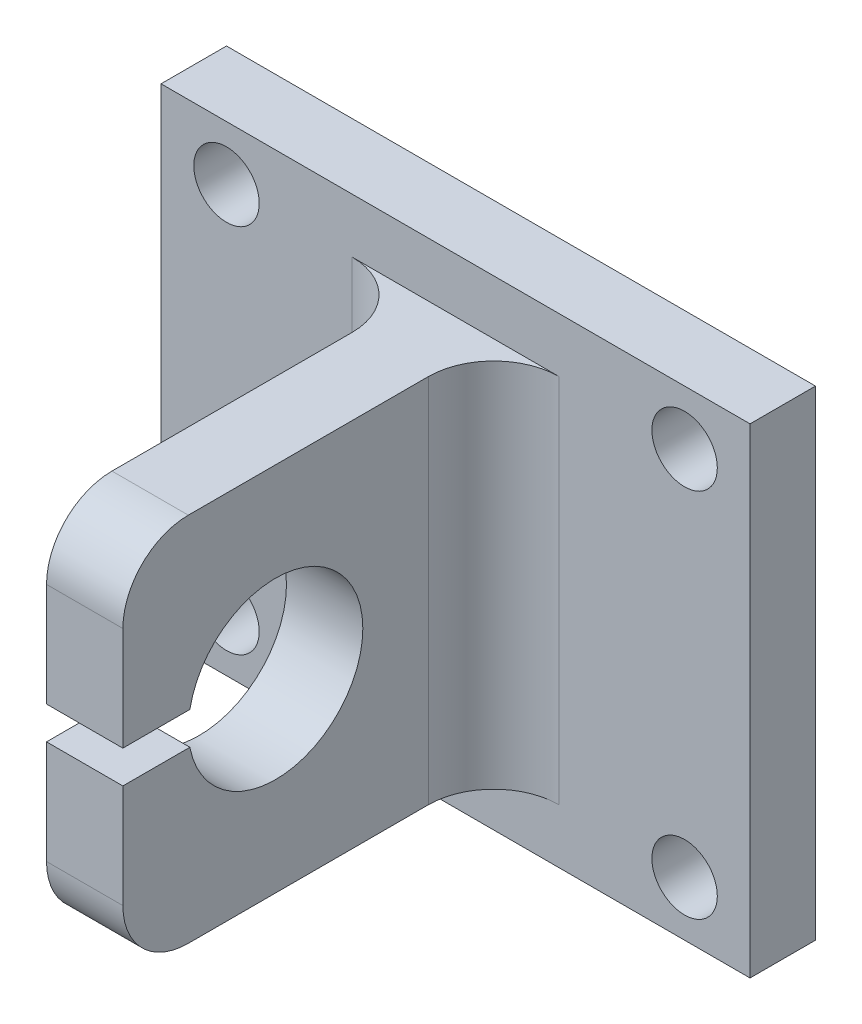
ISO-10303-21;
HEADER;
FILE_DESCRIPTION(('STEP AP214'),'2;1');
FILE_NAME('part.step','',(''),(''),'','','');
FILE_SCHEMA(('AUTOMOTIVE_DESIGN { 1 0 10303 214 1 1 1 1 }'));
ENDSEC;
DATA;
#1=APPLICATION_CONTEXT('core data for automotive mechanical design processes');
#2=APPLICATION_PROTOCOL_DEFINITION('international standard','automotive_design',2000,#1);
#3=PRODUCT_CONTEXT('',#1,'mechanical');
#4=PRODUCT('Part','Part','',(#3));
#5=PRODUCT_RELATED_PRODUCT_CATEGORY('part','',(#4));
#6=PRODUCT_DEFINITION_FORMATION('','',#4);
#7=PRODUCT_DEFINITION_CONTEXT('part definition',#1,'design');
#8=PRODUCT_DEFINITION('design','',#6,#7);
#9=PRODUCT_DEFINITION_SHAPE('','',#8);
#10=(LENGTH_UNIT() NAMED_UNIT(*) SI_UNIT(.MILLI.,.METRE.));
#11=(NAMED_UNIT(*) PLANE_ANGLE_UNIT() SI_UNIT($,.RADIAN.));
#12=(NAMED_UNIT(*) SI_UNIT($,.STERADIAN.) SOLID_ANGLE_UNIT());
#13=UNCERTAINTY_MEASURE_WITH_UNIT(LENGTH_MEASURE(1.E-05),#10,'distance_accuracy_value','');
#14=(GEOMETRIC_REPRESENTATION_CONTEXT(3) GLOBAL_UNCERTAINTY_ASSIGNED_CONTEXT((#13)) GLOBAL_UNIT_ASSIGNED_CONTEXT((#10,
#11,#12)) REPRESENTATION_CONTEXT('',''));
#15=CARTESIAN_POINT('',(0.,0.,0.));
#16=DIRECTION('',(0.,0.,1.));
#17=DIRECTION('',(1.,0.,0.));
#18=AXIS2_PLACEMENT_3D('',#15,#16,#17);
#19=CARTESIAN_POINT('',(0.,0.,20.));
#20=DIRECTION('',(0.,0.,1.));
#21=DIRECTION('',(1.,0.,0.));
#22=AXIS2_PLACEMENT_3D('',#19,#20,#21);
#23=PLANE('',#22);
#24=DIRECTION('',(0.,1.,0.));
#25=VECTOR('',#24,1.);
#26=CARTESIAN_POINT('',(1.75,8.5,20.));
#27=LINE('',#26,#25);
#28=CARTESIAN_POINT('',(1.75,0.75,20.));
#29=VERTEX_POINT('',#28);
#30=CARTESIAN_POINT('',(1.75,5.5,20.));
#31=VERTEX_POINT('',#30);
#32=EDGE_CURVE('E201',#29,#31,#27,.T.);
#33=ORIENTED_EDGE('',*,*,#32,.T.);
#34=DIRECTION('',(-1.,0.,0.));
#35=VECTOR('',#34,1.);
#36=CARTESIAN_POINT('',(-1.75,5.5,20.));
#37=LINE('',#36,#35);
#38=CARTESIAN_POINT('',(-1.75,5.5,20.));
#39=VERTEX_POINT('',#38);
#40=EDGE_CURVE('E326',#31,#39,#37,.T.);
#41=ORIENTED_EDGE('',*,*,#40,.T.);
#42=DIRECTION('',(0.,-1.,0.));
#43=VECTOR('',#42,1.);
#44=CARTESIAN_POINT('',(-1.75,8.5,20.));
#45=LINE('',#44,#43);
#46=CARTESIAN_POINT('',(-1.75,0.75,20.));
#47=VERTEX_POINT('',#46);
#48=EDGE_CURVE('E198',#39,#47,#45,.T.);
#49=ORIENTED_EDGE('',*,*,#48,.T.);
#50=DIRECTION('',(-1.,0.,0.));
#51=VECTOR('',#50,1.);
#52=CARTESIAN_POINT('',(0.,0.75,20.));
#53=LINE('',#52,#51);
#54=EDGE_CURVE('E193',#29,#47,#53,.T.);
#55=ORIENTED_EDGE('',*,*,#54,.F.);
#56=EDGE_LOOP('',(#33,#41,#49,#55));
#57=FACE_BOUND('',#56,.T.);
#58=ADVANCED_FACE('F43',(#57),#23,.T.);
#59=CARTESIAN_POINT('',(0.,0.,3.));
#60=DIRECTION('',(0.,0.,-1.));
#61=DIRECTION('',(-1.,0.,0.));
#62=AXIS2_PLACEMENT_3D('',#59,#60,#61);
#63=PLANE('',#62);
#64=CARTESIAN_POINT('',(-10.5,8.5,3.));
#65=DIRECTION('',(0.,0.,1.));
#66=DIRECTION('',(1.,0.,0.));
#67=AXIS2_PLACEMENT_3D('',#64,#65,#66);
#68=CIRCLE('',#67,1.5);
#69=CARTESIAN_POINT('',(-9.,8.5,3.));
#70=VERTEX_POINT('',#69);
#71=EDGE_CURVE('E220',#70,#70,#68,.T.);
#72=ORIENTED_EDGE('',*,*,#71,.F.);
#73=EDGE_LOOP('',(#72));
#74=FACE_BOUND('',#73,.T.);
#75=CARTESIAN_POINT('',(-10.5,-8.5,3.));
#76=DIRECTION('',(0.,0.,1.));
#77=DIRECTION('',(1.,0.,0.));
#78=AXIS2_PLACEMENT_3D('',#75,#76,#77);
#79=CIRCLE('',#78,1.5);
#80=CARTESIAN_POINT('',(-9.,-8.5,3.));
#81=VERTEX_POINT('',#80);
#82=EDGE_CURVE('E228',#81,#81,#79,.T.);
#83=ORIENTED_EDGE('',*,*,#82,.F.);
#84=EDGE_LOOP('',(#83));
#85=FACE_BOUND('',#84,.T.);
#86=CARTESIAN_POINT('',(10.5,-8.5,3.));
#87=DIRECTION('',(0.,0.,1.));
#88=DIRECTION('',(1.,0.,0.));
#89=AXIS2_PLACEMENT_3D('',#86,#87,#88);
#90=CIRCLE('',#89,1.5);
#91=CARTESIAN_POINT('',(12.,-8.5,3.));
#92=VERTEX_POINT('',#91);
#93=EDGE_CURVE('E236',#92,#92,#90,.T.);
#94=ORIENTED_EDGE('',*,*,#93,.F.);
#95=EDGE_LOOP('',(#94));
#96=FACE_BOUND('',#95,.T.);
#97=CARTESIAN_POINT('',(10.5,8.5,3.));
#98=DIRECTION('',(0.,0.,1.));
#99=DIRECTION('',(1.,0.,0.));
#100=AXIS2_PLACEMENT_3D('',#97,#98,#99);
#101=CIRCLE('',#100,1.5);
#102=CARTESIAN_POINT('',(12.,8.5,3.));
#103=VERTEX_POINT('',#102);
#104=EDGE_CURVE('E244',#103,#103,#101,.T.);
#105=ORIENTED_EDGE('',*,*,#104,.F.);
#106=EDGE_LOOP('',(#105));
#107=FACE_BOUND('',#106,.T.);
#108=DIRECTION('',(0.,1.,0.));
#109=VECTOR('',#108,1.);
#110=CARTESIAN_POINT('',(13.5,-11.,3.));
#111=LINE('',#110,#109);
#112=CARTESIAN_POINT('',(13.5,-11.,3.));
#113=VERTEX_POINT('',#112);
#114=CARTESIAN_POINT('',(13.5,11.,3.));
#115=VERTEX_POINT('',#114);
#116=EDGE_CURVE('E252',#113,#115,#111,.T.);
#117=ORIENTED_EDGE('',*,*,#116,.T.);
#118=DIRECTION('',(-1.,0.,0.));
#119=VECTOR('',#118,1.);
#120=CARTESIAN_POINT('',(-13.5,11.,3.));
#121=LINE('',#120,#119);
#122=CARTESIAN_POINT('',(-13.5,11.,3.));
#123=VERTEX_POINT('',#122);
#124=EDGE_CURVE('E256',#115,#123,#121,.T.);
#125=ORIENTED_EDGE('',*,*,#124,.T.);
#126=DIRECTION('',(0.,-1.,0.));
#127=VECTOR('',#126,1.);
#128=CARTESIAN_POINT('',(-13.5,-11.,3.));
#129=LINE('',#128,#127);
#130=CARTESIAN_POINT('',(-13.5,-11.,3.));
#131=VERTEX_POINT('',#130);
#132=EDGE_CURVE('E260',#123,#131,#129,.T.);
#133=ORIENTED_EDGE('',*,*,#132,.T.);
#134=DIRECTION('',(1.,0.,0.));
#135=VECTOR('',#134,1.);
#136=CARTESIAN_POINT('',(-13.5,-11.,3.));
#137=LINE('',#136,#135);
#138=EDGE_CURVE('E263',#131,#113,#137,.T.);
#139=ORIENTED_EDGE('',*,*,#138,.T.);
#140=EDGE_LOOP('',(#117,#125,#133,#139));
#141=FACE_BOUND('',#140,.T.);
#142=DIRECTION('',(1.,0.,0.));
#143=VECTOR('',#142,1.);
#144=CARTESIAN_POINT('',(-1.75,-8.5,3.));
#145=LINE('',#144,#143);
#146=CARTESIAN_POINT('',(-4.75,-8.5,3.));
#147=VERTEX_POINT('',#146);
#148=CARTESIAN_POINT('',(4.75,-8.5,3.));
#149=VERTEX_POINT('',#148);
#150=EDGE_CURVE('E186',#147,#149,#145,.T.);
#151=ORIENTED_EDGE('',*,*,#150,.F.);
#152=DIRECTION('',(0.,-1.,0.));
#153=VECTOR('',#152,1.);
#154=CARTESIAN_POINT('',(-4.75,8.5,3.));
#155=LINE('',#154,#153);
#156=CARTESIAN_POINT('',(-4.75,8.5,3.));
#157=VERTEX_POINT('',#156);
#158=EDGE_CURVE('E302',#147,#157,#155,.F.);
#159=ORIENTED_EDGE('',*,*,#158,.T.);
#160=DIRECTION('',(-1.,0.,0.));
#161=VECTOR('',#160,1.);
#162=CARTESIAN_POINT('',(-1.75,8.5,3.));
#163=LINE('',#162,#161);
#164=CARTESIAN_POINT('',(4.75,8.5,3.));
#165=VERTEX_POINT('',#164);
#166=EDGE_CURVE('E191',#165,#157,#163,.T.);
#167=ORIENTED_EDGE('',*,*,#166,.F.);
#168=DIRECTION('',(0.,1.,0.));
#169=VECTOR('',#168,1.);
#170=CARTESIAN_POINT('',(4.75,-8.5,3.));
#171=LINE('',#170,#169);
#172=EDGE_CURVE('E298',#165,#149,#171,.F.);
#173=ORIENTED_EDGE('',*,*,#172,.T.);
#174=EDGE_LOOP('',(#151,#159,#167,#173));
#175=FACE_BOUND('',#174,.T.);
#176=ADVANCED_FACE('F393',(#74,#85,#96,#107,#141,#175),#63,.F.);
#177=CARTESIAN_POINT('',(0.,0.,0.));
#178=DIRECTION('',(0.,0.,-1.));
#179=DIRECTION('',(-1.,0.,0.));
#180=AXIS2_PLACEMENT_3D('',#177,#178,#179);
#181=PLANE('',#180);
#182=CARTESIAN_POINT('',(-10.5,-8.5,0.));
#183=DIRECTION('',(0.,0.,1.));
#184=DIRECTION('',(1.,0.,0.));
#185=AXIS2_PLACEMENT_3D('',#182,#183,#184);
#186=CIRCLE('',#185,1.5);
#187=CARTESIAN_POINT('',(-9.,-8.5,0.));
#188=VERTEX_POINT('',#187);
#189=EDGE_CURVE('E224',#188,#188,#186,.T.);
#190=ORIENTED_EDGE('',*,*,#189,.T.);
#191=EDGE_LOOP('',(#190));
#192=FACE_BOUND('',#191,.T.);
#193=CARTESIAN_POINT('',(10.5,8.5,0.));
#194=DIRECTION('',(0.,0.,1.));
#195=DIRECTION('',(1.,0.,0.));
#196=AXIS2_PLACEMENT_3D('',#193,#194,#195);
#197=CIRCLE('',#196,1.5);
#198=CARTESIAN_POINT('',(12.,8.5,0.));
#199=VERTEX_POINT('',#198);
#200=EDGE_CURVE('E240',#199,#199,#197,.T.);
#201=ORIENTED_EDGE('',*,*,#200,.T.);
#202=EDGE_LOOP('',(#201));
#203=FACE_BOUND('',#202,.T.);
#204=DIRECTION('',(0.,1.,0.));
#205=VECTOR('',#204,1.);
#206=CARTESIAN_POINT('',(13.5,-11.,0.));
#207=LINE('',#206,#205);
#208=CARTESIAN_POINT('',(13.5,-11.,0.));
#209=VERTEX_POINT('',#208);
#210=CARTESIAN_POINT('',(13.5,11.,0.));
#211=VERTEX_POINT('',#210);
#212=EDGE_CURVE('E248',#209,#211,#207,.T.);
#213=ORIENTED_EDGE('',*,*,#212,.F.);
#214=DIRECTION('',(1.,0.,0.));
#215=VECTOR('',#214,1.);
#216=CARTESIAN_POINT('',(-13.5,-11.,0.));
#217=LINE('',#216,#215);
#218=CARTESIAN_POINT('',(-13.5,-11.,0.));
#219=VERTEX_POINT('',#218);
#220=EDGE_CURVE('E257',#219,#209,#217,.T.);
#221=ORIENTED_EDGE('',*,*,#220,.F.);
#222=DIRECTION('',(0.,-1.,0.));
#223=VECTOR('',#222,1.);
#224=CARTESIAN_POINT('',(-13.5,-11.,0.));
#225=LINE('',#224,#223);
#226=CARTESIAN_POINT('',(-13.5,11.,0.));
#227=VERTEX_POINT('',#226);
#228=EDGE_CURVE('E273',#227,#219,#225,.T.);
#229=ORIENTED_EDGE('',*,*,#228,.F.);
#230=DIRECTION('',(-1.,0.,0.));
#231=VECTOR('',#230,1.);
#232=CARTESIAN_POINT('',(-13.5,11.,0.));
#233=LINE('',#232,#231);
#234=EDGE_CURVE('E270',#211,#227,#233,.T.);
#235=ORIENTED_EDGE('',*,*,#234,.F.);
#236=EDGE_LOOP('',(#213,#221,#229,#235));
#237=FACE_BOUND('',#236,.T.);
#238=CARTESIAN_POINT('',(10.5,-8.5,0.));
#239=DIRECTION('',(0.,0.,1.));
#240=DIRECTION('',(1.,0.,0.));
#241=AXIS2_PLACEMENT_3D('',#238,#239,#240);
#242=CIRCLE('',#241,1.5);
#243=CARTESIAN_POINT('',(12.,-8.5,0.));
#244=VERTEX_POINT('',#243);
#245=EDGE_CURVE('E232',#244,#244,#242,.T.);
#246=ORIENTED_EDGE('',*,*,#245,.T.);
#247=EDGE_LOOP('',(#246));
#248=FACE_BOUND('',#247,.T.);
#249=CARTESIAN_POINT('',(-10.5,8.5,0.));
#250=DIRECTION('',(0.,0.,1.));
#251=DIRECTION('',(1.,0.,0.));
#252=AXIS2_PLACEMENT_3D('',#249,#250,#251);
#253=CIRCLE('',#252,1.5);
#254=CARTESIAN_POINT('',(-9.,8.5,0.));
#255=VERTEX_POINT('',#254);
#256=EDGE_CURVE('E219',#255,#255,#253,.T.);
#257=ORIENTED_EDGE('',*,*,#256,.T.);
#258=EDGE_LOOP('',(#257));
#259=FACE_BOUND('',#258,.T.);
#260=ADVANCED_FACE('F395',(#192,#203,#237,#248,#259),#181,.T.);
#261=CARTESIAN_POINT('',(13.5,-11.,3.));
#262=DIRECTION('',(-1.,0.,0.));
#263=DIRECTION('',(0.,0.,1.));
#264=AXIS2_PLACEMENT_3D('',#261,#262,#263);
#265=PLANE('',#264);
#266=ORIENTED_EDGE('',*,*,#212,.T.);
#267=DIRECTION('',(0.,0.,-1.));
#268=VECTOR('',#267,1.);
#269=CARTESIAN_POINT('',(13.5,11.,3.));
#270=LINE('',#269,#268);
#271=EDGE_CURVE('E169',#115,#211,#270,.T.);
#272=ORIENTED_EDGE('',*,*,#271,.F.);
#273=ORIENTED_EDGE('',*,*,#116,.F.);
#274=DIRECTION('',(0.,0.,-1.));
#275=VECTOR('',#274,1.);
#276=CARTESIAN_POINT('',(13.5,-11.,3.));
#277=LINE('',#276,#275);
#278=EDGE_CURVE('E266',#113,#209,#277,.T.);
#279=ORIENTED_EDGE('',*,*,#278,.T.);
#280=EDGE_LOOP('',(#266,#272,#273,#279));
#281=FACE_BOUND('',#280,.T.);
#282=ADVANCED_FACE('F402',(#281),#265,.F.);
#283=CARTESIAN_POINT('',(-13.5,11.,3.));
#284=DIRECTION('',(0.,-1.,0.));
#285=DIRECTION('',(0.,0.,-1.));
#286=AXIS2_PLACEMENT_3D('',#283,#284,#285);
#287=PLANE('',#286);
#288=ORIENTED_EDGE('',*,*,#234,.T.);
#289=DIRECTION('',(0.,0.,-1.));
#290=VECTOR('',#289,1.);
#291=CARTESIAN_POINT('',(-13.5,11.,3.));
#292=LINE('',#291,#290);
#293=EDGE_CURVE('E285',#123,#227,#292,.T.);
#294=ORIENTED_EDGE('',*,*,#293,.F.);
#295=ORIENTED_EDGE('',*,*,#124,.F.);
#296=ORIENTED_EDGE('',*,*,#271,.T.);
#297=EDGE_LOOP('',(#288,#294,#295,#296));
#298=FACE_BOUND('',#297,.T.);
#299=ADVANCED_FACE('F419',(#298),#287,.F.);
#300=CARTESIAN_POINT('',(-13.5,-11.,3.));
#301=DIRECTION('',(1.,0.,0.));
#302=DIRECTION('',(0.,0.,-1.));
#303=AXIS2_PLACEMENT_3D('',#300,#301,#302);
#304=PLANE('',#303);
#305=ORIENTED_EDGE('',*,*,#228,.T.);
#306=DIRECTION('',(0.,0.,-1.));
#307=VECTOR('',#306,1.);
#308=CARTESIAN_POINT('',(-13.5,-11.,3.));
#309=LINE('',#308,#307);
#310=EDGE_CURVE('E281',#131,#219,#309,.T.);
#311=ORIENTED_EDGE('',*,*,#310,.F.);
#312=ORIENTED_EDGE('',*,*,#132,.F.);
#313=ORIENTED_EDGE('',*,*,#293,.T.);
#314=EDGE_LOOP('',(#305,#311,#312,#313));
#315=FACE_BOUND('',#314,.T.);
#316=ADVANCED_FACE('F415',(#315),#304,.F.);
#317=CARTESIAN_POINT('',(-13.5,-11.,3.));
#318=DIRECTION('',(0.,1.,0.));
#319=DIRECTION('',(0.,0.,1.));
#320=AXIS2_PLACEMENT_3D('',#317,#318,#319);
#321=PLANE('',#320);
#322=ORIENTED_EDGE('',*,*,#220,.T.);
#323=ORIENTED_EDGE('',*,*,#278,.F.);
#324=ORIENTED_EDGE('',*,*,#138,.F.);
#325=ORIENTED_EDGE('',*,*,#310,.T.);
#326=EDGE_LOOP('',(#322,#323,#324,#325));
#327=FACE_BOUND('',#326,.T.);
#328=ADVANCED_FACE('F412',(#327),#321,.F.);
#329=CARTESIAN_POINT('',(10.5,8.5,3.));
#330=DIRECTION('',(0.,0.,-1.));
#331=DIRECTION('',(-1.,0.,0.));
#332=AXIS2_PLACEMENT_3D('',#329,#330,#331);
#333=CYLINDRICAL_SURFACE('',#332,1.5);
#334=ORIENTED_EDGE('',*,*,#104,.T.);
#335=EDGE_LOOP('',(#334));
#336=FACE_BOUND('',#335,.T.);
#337=ORIENTED_EDGE('',*,*,#200,.F.);
#338=EDGE_LOOP('',(#337));
#339=FACE_BOUND('',#338,.T.);
#340=ADVANCED_FACE('F409',(#336,#339),#333,.F.);
#341=CARTESIAN_POINT('',(10.5,-8.5,3.));
#342=DIRECTION('',(0.,0.,-1.));
#343=DIRECTION('',(-1.,0.,0.));
#344=AXIS2_PLACEMENT_3D('',#341,#342,#343);
#345=CYLINDRICAL_SURFACE('',#344,1.5);
#346=ORIENTED_EDGE('',*,*,#93,.T.);
#347=EDGE_LOOP('',(#346));
#348=FACE_BOUND('',#347,.T.);
#349=ORIENTED_EDGE('',*,*,#245,.F.);
#350=EDGE_LOOP('',(#349));
#351=FACE_BOUND('',#350,.T.);
#352=ADVANCED_FACE('F558',(#348,#351),#345,.F.);
#353=CARTESIAN_POINT('',(-10.5,-8.5,3.));
#354=DIRECTION('',(0.,0.,-1.));
#355=DIRECTION('',(-1.,0.,0.));
#356=AXIS2_PLACEMENT_3D('',#353,#354,#355);
#357=CYLINDRICAL_SURFACE('',#356,1.5);
#358=ORIENTED_EDGE('',*,*,#82,.T.);
#359=EDGE_LOOP('',(#358));
#360=FACE_BOUND('',#359,.T.);
#361=ORIENTED_EDGE('',*,*,#189,.F.);
#362=EDGE_LOOP('',(#361));
#363=FACE_BOUND('',#362,.T.);
#364=ADVANCED_FACE('F548',(#360,#363),#357,.F.);
#365=CARTESIAN_POINT('',(-10.5,8.5,3.));
#366=DIRECTION('',(0.,0.,-1.));
#367=DIRECTION('',(-1.,0.,0.));
#368=AXIS2_PLACEMENT_3D('',#365,#366,#367);
#369=CYLINDRICAL_SURFACE('',#368,1.5);
#370=ORIENTED_EDGE('',*,*,#71,.T.);
#371=EDGE_LOOP('',(#370));
#372=FACE_BOUND('',#371,.T.);
#373=ORIENTED_EDGE('',*,*,#256,.F.);
#374=EDGE_LOOP('',(#373));
#375=FACE_BOUND('',#374,.T.);
#376=ADVANCED_FACE('F489',(#372,#375),#369,.F.);
#377=CARTESIAN_POINT('',(-1.75,8.5,20.));
#378=DIRECTION('',(1.,0.,0.));
#379=DIRECTION('',(0.,1.,0.));
#380=AXIS2_PLACEMENT_3D('',#377,#378,#379);
#381=PLANE('',#380);
#382=ORIENTED_EDGE('',*,*,#48,.F.);
#383=CARTESIAN_POINT('',(-1.75,5.5,17.));
#384=DIRECTION('',(1.,0.,0.));
#385=DIRECTION('',(0.,1.,0.));
#386=AXIS2_PLACEMENT_3D('',#383,#384,#385);
#387=CIRCLE('',#386,3.);
#388=CARTESIAN_POINT('',(-1.75,8.5,17.));
#389=VERTEX_POINT('',#388);
#390=EDGE_CURVE('E333',#39,#389,#387,.F.);
#391=ORIENTED_EDGE('',*,*,#390,.T.);
#392=DIRECTION('',(0.,0.,-1.));
#393=VECTOR('',#392,1.);
#394=CARTESIAN_POINT('',(-1.75,8.5,20.));
#395=LINE('',#394,#393);
#396=CARTESIAN_POINT('',(-1.75,8.5,6.));
#397=VERTEX_POINT('',#396);
#398=EDGE_CURVE('E204',#389,#397,#395,.T.);
#399=ORIENTED_EDGE('',*,*,#398,.T.);
#400=DIRECTION('',(0.,-1.,0.));
#401=VECTOR('',#400,1.);
#402=CARTESIAN_POINT('',(-1.75,-8.5,6.));
#403=LINE('',#402,#401);
#404=CARTESIAN_POINT('',(-1.75,-8.5,6.));
#405=VERTEX_POINT('',#404);
#406=EDGE_CURVE('E294',#397,#405,#403,.T.);
#407=ORIENTED_EDGE('',*,*,#406,.T.);
#408=DIRECTION('',(0.,0.,-1.));
#409=VECTOR('',#408,1.);
#410=CARTESIAN_POINT('',(-1.75,-8.5,20.));
#411=LINE('',#410,#409);
#412=CARTESIAN_POINT('',(-1.75,-8.5,17.));
#413=VERTEX_POINT('',#412);
#414=EDGE_CURVE('E216',#413,#405,#411,.T.);
#415=ORIENTED_EDGE('',*,*,#414,.F.);
#416=CARTESIAN_POINT('',(-1.75,-5.5,17.));
#417=DIRECTION('',(1.,0.,0.));
#418=DIRECTION('',(0.,1.,0.));
#419=AXIS2_PLACEMENT_3D('',#416,#417,#418);
#420=CIRCLE('',#419,3.);
#421=CARTESIAN_POINT('',(-1.75,-5.5,20.));
#422=VERTEX_POINT('',#421);
#423=EDGE_CURVE('E330',#413,#422,#420,.F.);
#424=ORIENTED_EDGE('',*,*,#423,.T.);
#425=CARTESIAN_POINT('',(-1.75,-0.749999999999999,20.));
#426=VERTEX_POINT('',#425);
#427=EDGE_CURVE('E179',#426,#422,#45,.T.);
#428=ORIENTED_EDGE('',*,*,#427,.F.);
#429=DIRECTION('',(0.,0.,-1.));
#430=VECTOR('',#429,1.);
#431=CARTESIAN_POINT('',(-1.75,-0.749999999999999,20.));
#432=LINE('',#431,#430);
#433=CARTESIAN_POINT('',(-1.75,-0.75,16.9290584113754));
#434=VERTEX_POINT('',#433);
#435=EDGE_CURVE('E159',#426,#434,#432,.T.);
#436=ORIENTED_EDGE('',*,*,#435,.T.);
#437=CARTESIAN_POINT('',(-1.75,0.,13.));
#438=DIRECTION('',(1.,0.,0.));
#439=DIRECTION('',(0.,1.,0.));
#440=AXIS2_PLACEMENT_3D('',#437,#438,#439);
#441=CIRCLE('',#440,4.);
#442=CARTESIAN_POINT('',(-1.75,0.75,16.9290584113754));
#443=VERTEX_POINT('',#442);
#444=EDGE_CURVE('E177',#434,#443,#441,.T.);
#445=ORIENTED_EDGE('',*,*,#444,.T.);
#446=DIRECTION('',(0.,0.,1.));
#447=VECTOR('',#446,1.);
#448=CARTESIAN_POINT('',(-1.75,0.75,20.));
#449=LINE('',#448,#447);
#450=EDGE_CURVE('E357',#443,#47,#449,.T.);
#451=ORIENTED_EDGE('',*,*,#450,.T.);
#452=EDGE_LOOP('',(#382,#391,#399,#407,#415,#424,#428,#436,#445,#451));
#453=FACE_BOUND('',#452,.T.);
#454=ADVANCED_FACE('F175',(#453),#381,.F.);
#455=CARTESIAN_POINT('',(-1.75,-8.5,20.));
#456=DIRECTION('',(0.,1.,0.));
#457=DIRECTION('',(0.,0.,1.));
#458=AXIS2_PLACEMENT_3D('',#455,#456,#457);
#459=PLANE('',#458);
#460=DIRECTION('',(0.,0.,-1.));
#461=VECTOR('',#460,1.);
#462=CARTESIAN_POINT('',(1.75,-8.5,20.));
#463=LINE('',#462,#461);
#464=CARTESIAN_POINT('',(1.75,-8.5,17.));
#465=VERTEX_POINT('',#464);
#466=CARTESIAN_POINT('',(1.75,-8.5,6.));
#467=VERTEX_POINT('',#466);
#468=EDGE_CURVE('E213',#465,#467,#463,.T.);
#469=ORIENTED_EDGE('',*,*,#468,.F.);
#470=DIRECTION('',(1.,0.,0.));
#471=VECTOR('',#470,1.);
#472=CARTESIAN_POINT('',(-1.75,-8.5,17.));
#473=LINE('',#472,#471);
#474=EDGE_CURVE('E11',#465,#413,#473,.F.);
#475=ORIENTED_EDGE('',*,*,#474,.T.);
#476=ORIENTED_EDGE('',*,*,#414,.T.);
#477=CARTESIAN_POINT('',(-4.75,-8.5,6.));
#478=DIRECTION('',(0.,1.,0.));
#479=DIRECTION('',(0.,0.,1.));
#480=AXIS2_PLACEMENT_3D('',#477,#478,#479);
#481=CIRCLE('',#480,3.);
#482=EDGE_CURVE('E310',#405,#147,#481,.T.);
#483=ORIENTED_EDGE('',*,*,#482,.T.);
#484=ORIENTED_EDGE('',*,*,#150,.T.);
#485=CARTESIAN_POINT('',(4.75,-8.5,6.));
#486=DIRECTION('',(0.,1.,0.));
#487=DIRECTION('',(0.,0.,1.));
#488=AXIS2_PLACEMENT_3D('',#485,#486,#487);
#489=CIRCLE('',#488,3.);
#490=EDGE_CURVE('E322',#149,#467,#489,.T.);
#491=ORIENTED_EDGE('',*,*,#490,.T.);
#492=EDGE_LOOP('',(#469,#475,#476,#483,#484,#491));
#493=FACE_BOUND('',#492,.T.);
#494=ADVANCED_FACE('F385',(#493),#459,.F.);
#495=CARTESIAN_POINT('',(1.75,8.5,20.));
#496=DIRECTION('',(-1.,0.,0.));
#497=DIRECTION('',(0.,-1.,0.));
#498=AXIS2_PLACEMENT_3D('',#495,#496,#497);
#499=PLANE('',#498);
#500=DIRECTION('',(0.,0.,-1.));
#501=VECTOR('',#500,1.);
#502=CARTESIAN_POINT('',(1.75,8.5,20.));
#503=LINE('',#502,#501);
#504=CARTESIAN_POINT('',(1.75,8.5,17.));
#505=VERTEX_POINT('',#504);
#506=CARTESIAN_POINT('',(1.75,8.5,6.));
#507=VERTEX_POINT('',#506);
#508=EDGE_CURVE('E210',#505,#507,#503,.T.);
#509=ORIENTED_EDGE('',*,*,#508,.F.);
#510=CARTESIAN_POINT('',(1.75,5.5,17.));
#511=DIRECTION('',(-1.,0.,0.));
#512=DIRECTION('',(0.,-1.,0.));
#513=AXIS2_PLACEMENT_3D('',#510,#511,#512);
#514=CIRCLE('',#513,3.);
#515=EDGE_CURVE('E341',#505,#31,#514,.F.);
#516=ORIENTED_EDGE('',*,*,#515,.T.);
#517=ORIENTED_EDGE('',*,*,#32,.F.);
#518=DIRECTION('',(0.,0.,-1.));
#519=VECTOR('',#518,1.);
#520=CARTESIAN_POINT('',(1.75,0.75,20.));
#521=LINE('',#520,#519);
#522=CARTESIAN_POINT('',(1.75,0.75,16.9290584113754));
#523=VERTEX_POINT('',#522);
#524=EDGE_CURVE('E355',#29,#523,#521,.T.);
#525=ORIENTED_EDGE('',*,*,#524,.T.);
#526=CARTESIAN_POINT('',(1.75,0.,13.));
#527=DIRECTION('',(-1.,0.,0.));
#528=DIRECTION('',(0.,-1.,0.));
#529=AXIS2_PLACEMENT_3D('',#526,#527,#528);
#530=CIRCLE('',#529,4.);
#531=CARTESIAN_POINT('',(1.75,-0.75,16.9290584113754));
#532=VERTEX_POINT('',#531);
#533=EDGE_CURVE('E187',#523,#532,#530,.T.);
#534=ORIENTED_EDGE('',*,*,#533,.T.);
#535=DIRECTION('',(0.,0.,1.));
#536=VECTOR('',#535,1.);
#537=CARTESIAN_POINT('',(1.75,-0.749999999999999,20.));
#538=LINE('',#537,#536);
#539=CARTESIAN_POINT('',(1.75,-0.749999999999999,20.));
#540=VERTEX_POINT('',#539);
#541=EDGE_CURVE('E162',#532,#540,#538,.T.);
#542=ORIENTED_EDGE('',*,*,#541,.T.);
#543=CARTESIAN_POINT('',(1.75,-5.5,20.));
#544=VERTEX_POINT('',#543);
#545=EDGE_CURVE('E202',#544,#540,#27,.T.);
#546=ORIENTED_EDGE('',*,*,#545,.F.);
#547=CARTESIAN_POINT('',(1.75,-5.5,17.));
#548=DIRECTION('',(-1.,0.,0.));
#549=DIRECTION('',(0.,-1.,0.));
#550=AXIS2_PLACEMENT_3D('',#547,#548,#549);
#551=CIRCLE('',#550,3.);
#552=EDGE_CURVE('E59',#544,#465,#551,.F.);
#553=ORIENTED_EDGE('',*,*,#552,.T.);
#554=ORIENTED_EDGE('',*,*,#468,.T.);
#555=DIRECTION('',(0.,1.,0.));
#556=VECTOR('',#555,1.);
#557=CARTESIAN_POINT('',(1.75,8.5,6.));
#558=LINE('',#557,#556);
#559=EDGE_CURVE('E306',#467,#507,#558,.T.);
#560=ORIENTED_EDGE('',*,*,#559,.T.);
#561=EDGE_LOOP('',(#509,#516,#517,#525,#534,#542,#546,#553,#554,#560));
#562=FACE_BOUND('',#561,.T.);
#563=ADVANCED_FACE('F348',(#562),#499,.F.);
#564=CARTESIAN_POINT('',(-1.75,8.5,20.));
#565=DIRECTION('',(0.,-1.,0.));
#566=DIRECTION('',(0.,0.,-1.));
#567=AXIS2_PLACEMENT_3D('',#564,#565,#566);
#568=PLANE('',#567);
#569=ORIENTED_EDGE('',*,*,#398,.F.);
#570=DIRECTION('',(-1.,0.,0.));
#571=VECTOR('',#570,1.);
#572=CARTESIAN_POINT('',(1.75,8.5,17.));
#573=LINE('',#572,#571);
#574=EDGE_CURVE('E336',#389,#505,#573,.F.);
#575=ORIENTED_EDGE('',*,*,#574,.T.);
#576=ORIENTED_EDGE('',*,*,#508,.T.);
#577=CARTESIAN_POINT('',(4.75,8.5,6.));
#578=DIRECTION('',(0.,-1.,0.));
#579=DIRECTION('',(0.,0.,-1.));
#580=AXIS2_PLACEMENT_3D('',#577,#578,#579);
#581=CIRCLE('',#580,3.);
#582=EDGE_CURVE('E318',#507,#165,#581,.T.);
#583=ORIENTED_EDGE('',*,*,#582,.T.);
#584=ORIENTED_EDGE('',*,*,#166,.T.);
#585=CARTESIAN_POINT('',(-4.75,8.5,6.));
#586=DIRECTION('',(0.,-1.,0.));
#587=DIRECTION('',(0.,0.,-1.));
#588=AXIS2_PLACEMENT_3D('',#585,#586,#587);
#589=CIRCLE('',#588,3.);
#590=EDGE_CURVE('E314',#157,#397,#589,.T.);
#591=ORIENTED_EDGE('',*,*,#590,.T.);
#592=EDGE_LOOP('',(#569,#575,#576,#583,#584,#591));
#593=FACE_BOUND('',#592,.T.);
#594=ADVANCED_FACE('F376',(#593),#568,.F.);
#595=ORIENTED_EDGE('',*,*,#427,.T.);
#596=DIRECTION('',(1.,0.,0.));
#597=VECTOR('',#596,1.);
#598=CARTESIAN_POINT('',(1.75,-5.5,20.));
#599=LINE('',#598,#597);
#600=EDGE_CURVE('E52',#422,#544,#599,.T.);
#601=ORIENTED_EDGE('',*,*,#600,.T.);
#602=ORIENTED_EDGE('',*,*,#545,.T.);
#603=DIRECTION('',(1.,0.,0.));
#604=VECTOR('',#603,1.);
#605=CARTESIAN_POINT('',(0.,-0.75,20.));
#606=LINE('',#605,#604);
#607=EDGE_CURVE('E181',#426,#540,#606,.T.);
#608=ORIENTED_EDGE('',*,*,#607,.F.);
#609=EDGE_LOOP('',(#595,#601,#602,#608));
#610=FACE_BOUND('',#609,.T.);
#611=ADVANCED_FACE('F345',(#610),#23,.T.);
#612=CARTESIAN_POINT('',(-13.5,0.,13.));
#613=DIRECTION('',(1.,0.,0.));
#614=DIRECTION('',(0.,1.,0.));
#615=AXIS2_PLACEMENT_3D('',#612,#613,#614);
#616=CYLINDRICAL_SURFACE('',#615,4.);
#617=ORIENTED_EDGE('',*,*,#533,.F.);
#618=DIRECTION('',(1.,0.,0.));
#619=VECTOR('',#618,1.);
#620=CARTESIAN_POINT('',(-13.5,0.749999999999999,16.9290584113754));
#621=LINE('',#620,#619);
#622=EDGE_CURVE('E168',#523,#443,#621,.F.);
#623=ORIENTED_EDGE('',*,*,#622,.T.);
#624=ORIENTED_EDGE('',*,*,#444,.F.);
#625=DIRECTION('',(1.,0.,0.));
#626=VECTOR('',#625,1.);
#627=CARTESIAN_POINT('',(-13.5,-0.750000000000001,16.9290584113754));
#628=LINE('',#627,#626);
#629=EDGE_CURVE('E155',#434,#532,#628,.T.);
#630=ORIENTED_EDGE('',*,*,#629,.T.);
#631=EDGE_LOOP('',(#617,#623,#624,#630));
#632=FACE_BOUND('',#631,.T.);
#633=ADVANCED_FACE('F184',(#632),#616,.F.);
#634=CARTESIAN_POINT('',(-13.5,-0.750000000000001,22.379605091956));
#635=DIRECTION('',(0.,-1.,0.));
#636=DIRECTION('',(1.,0.,0.));
#637=AXIS2_PLACEMENT_3D('',#634,#635,#636);
#638=PLANE('',#637);
#639=ORIENTED_EDGE('',*,*,#607,.T.);
#640=ORIENTED_EDGE('',*,*,#541,.F.);
#641=ORIENTED_EDGE('',*,*,#629,.F.);
#642=ORIENTED_EDGE('',*,*,#435,.F.);
#643=EDGE_LOOP('',(#639,#640,#641,#642));
#644=FACE_BOUND('',#643,.T.);
#645=ADVANCED_FACE('F158',(#644),#638,.F.);
#646=CARTESIAN_POINT('',(-13.5,0.749999999999999,22.379605091956));
#647=DIRECTION('',(0.,1.,0.));
#648=DIRECTION('',(-1.,0.,0.));
#649=AXIS2_PLACEMENT_3D('',#646,#647,#648);
#650=PLANE('',#649);
#651=ORIENTED_EDGE('',*,*,#54,.T.);
#652=ORIENTED_EDGE('',*,*,#450,.F.);
#653=ORIENTED_EDGE('',*,*,#622,.F.);
#654=ORIENTED_EDGE('',*,*,#524,.F.);
#655=EDGE_LOOP('',(#651,#652,#653,#654));
#656=FACE_BOUND('',#655,.T.);
#657=ADVANCED_FACE('F363',(#656),#650,.F.);
#658=CARTESIAN_POINT('',(-4.75,8.5,6.));
#659=DIRECTION('',(0.,1.,0.));
#660=DIRECTION('',(-1.,0.,0.));
#661=AXIS2_PLACEMENT_3D('',#658,#659,#660);
#662=CYLINDRICAL_SURFACE('',#661,3.);
#663=ORIENTED_EDGE('',*,*,#590,.F.);
#664=ORIENTED_EDGE('',*,*,#158,.F.);
#665=ORIENTED_EDGE('',*,*,#482,.F.);
#666=ORIENTED_EDGE('',*,*,#406,.F.);
#667=EDGE_LOOP('',(#663,#664,#665,#666));
#668=FACE_BOUND('',#667,.T.);
#669=ADVANCED_FACE('F382',(#668),#662,.F.);
#670=CARTESIAN_POINT('',(4.75,8.5,6.));
#671=DIRECTION('',(0.,-1.,0.));
#672=DIRECTION('',(1.,0.,0.));
#673=AXIS2_PLACEMENT_3D('',#670,#671,#672);
#674=CYLINDRICAL_SURFACE('',#673,3.);
#675=ORIENTED_EDGE('',*,*,#490,.F.);
#676=ORIENTED_EDGE('',*,*,#172,.F.);
#677=ORIENTED_EDGE('',*,*,#582,.F.);
#678=ORIENTED_EDGE('',*,*,#559,.F.);
#679=EDGE_LOOP('',(#675,#676,#677,#678));
#680=FACE_BOUND('',#679,.T.);
#681=ADVANCED_FACE('F390',(#680),#674,.F.);
#682=CARTESIAN_POINT('',(0.,5.5,17.));
#683=DIRECTION('',(1.,0.,0.));
#684=DIRECTION('',(0.,0.,-1.));
#685=AXIS2_PLACEMENT_3D('',#682,#683,#684);
#686=CYLINDRICAL_SURFACE('',#685,3.);
#687=ORIENTED_EDGE('',*,*,#515,.F.);
#688=ORIENTED_EDGE('',*,*,#574,.F.);
#689=ORIENTED_EDGE('',*,*,#390,.F.);
#690=ORIENTED_EDGE('',*,*,#40,.F.);
#691=EDGE_LOOP('',(#687,#688,#689,#690));
#692=FACE_BOUND('',#691,.T.);
#693=ADVANCED_FACE('F373',(#692),#686,.T.);
#694=CARTESIAN_POINT('',(0.,-5.5,17.));
#695=DIRECTION('',(-1.,0.,0.));
#696=DIRECTION('',(0.,0.,1.));
#697=AXIS2_PLACEMENT_3D('',#694,#695,#696);
#698=CYLINDRICAL_SURFACE('',#697,3.);
#699=ORIENTED_EDGE('',*,*,#423,.F.);
#700=ORIENTED_EDGE('',*,*,#474,.F.);
#701=ORIENTED_EDGE('',*,*,#552,.F.);
#702=ORIENTED_EDGE('',*,*,#600,.F.);
#703=EDGE_LOOP('',(#699,#700,#701,#702));
#704=FACE_BOUND('',#703,.T.);
#705=ADVANCED_FACE('F45',(#704),#698,.T.);
#706=CLOSED_SHELL('',(#58,#176,#260,#282,#299,#316,#328,#340,#352,#364,#376,#454,#494,#563,#594,
#611,#633,#645,#657,#669,#681,#693,#705));
#707=MANIFOLD_SOLID_BREP('B2',#706);
#708=ADVANCED_BREP_SHAPE_REPRESENTATION('',(#18,#707),#14);
#709=SHAPE_DEFINITION_REPRESENTATION(#9,#708);
ENDSEC;
END-ISO-10303-21;
